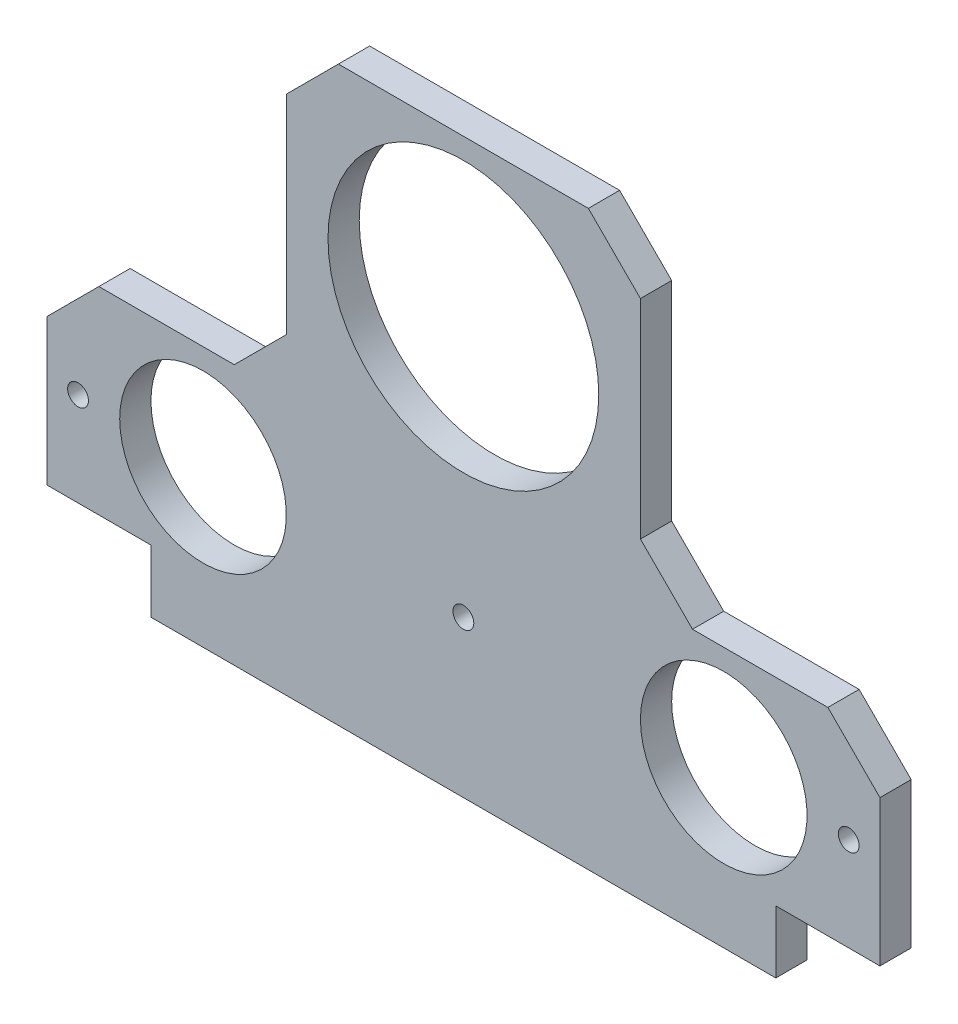
ISO-10303-21;
HEADER;
FILE_DESCRIPTION(('STEP AP214'),'2;1');
FILE_NAME('part.step','',(''),(''),'','','');
FILE_SCHEMA(('AUTOMOTIVE_DESIGN { 1 0 10303 214 1 1 1 1 }'));
ENDSEC;
DATA;
#1=APPLICATION_CONTEXT('core data for automotive mechanical design processes');
#2=APPLICATION_PROTOCOL_DEFINITION('international standard','automotive_design',2000,#1);
#3=PRODUCT_CONTEXT('',#1,'mechanical');
#4=PRODUCT('Part','Part','',(#3));
#5=PRODUCT_RELATED_PRODUCT_CATEGORY('part','',(#4));
#6=PRODUCT_DEFINITION_FORMATION('','',#4);
#7=PRODUCT_DEFINITION_CONTEXT('part definition',#1,'design');
#8=PRODUCT_DEFINITION('design','',#6,#7);
#9=PRODUCT_DEFINITION_SHAPE('','',#8);
#10=(LENGTH_UNIT() NAMED_UNIT(*) SI_UNIT(.MILLI.,.METRE.));
#11=(NAMED_UNIT(*) PLANE_ANGLE_UNIT() SI_UNIT($,.RADIAN.));
#12=(NAMED_UNIT(*) SI_UNIT($,.STERADIAN.) SOLID_ANGLE_UNIT());
#13=UNCERTAINTY_MEASURE_WITH_UNIT(LENGTH_MEASURE(1.E-05),#10,'distance_accuracy_value','');
#14=(GEOMETRIC_REPRESENTATION_CONTEXT(3) GLOBAL_UNCERTAINTY_ASSIGNED_CONTEXT((#13)) GLOBAL_UNIT_ASSIGNED_CONTEXT((#10,
#11,#12)) REPRESENTATION_CONTEXT('',''));
#15=CARTESIAN_POINT('',(0.,0.,0.));
#16=DIRECTION('',(0.,0.,1.));
#17=DIRECTION('',(1.,0.,0.));
#18=AXIS2_PLACEMENT_3D('',#15,#16,#17);
#19=CARTESIAN_POINT('',(-17.,25.,12.));
#20=DIRECTION('',(1.,0.,0.));
#21=DIRECTION('',(0.,1.,0.));
#22=AXIS2_PLACEMENT_3D('',#19,#20,#21);
#23=PLANE('',#22);
#24=DIRECTION('',(0.,0.,1.));
#25=VECTOR('',#24,1.);
#26=CARTESIAN_POINT('',(-17.,30.,12.));
#27=LINE('',#26,#25);
#28=CARTESIAN_POINT('',(-17.,30.,3.));
#29=VERTEX_POINT('',#28);
#30=CARTESIAN_POINT('',(-17.,30.,6.));
#31=VERTEX_POINT('',#30);
#32=EDGE_CURVE('E194',#29,#31,#27,.T.);
#33=ORIENTED_EDGE('',*,*,#32,.T.);
#34=DIRECTION('',(0.,1.,0.));
#35=VECTOR('',#34,1.);
#36=CARTESIAN_POINT('',(-17.,25.,6.));
#37=LINE('',#36,#35);
#38=CARTESIAN_POINT('',(-17.,50.,6.));
#39=VERTEX_POINT('',#38);
#40=EDGE_CURVE('E324',#31,#39,#37,.T.);
#41=ORIENTED_EDGE('',*,*,#40,.T.);
#42=DIRECTION('',(0.,0.,-1.));
#43=VECTOR('',#42,1.);
#44=CARTESIAN_POINT('',(-17.,50.,12.));
#45=LINE('',#44,#43);
#46=CARTESIAN_POINT('',(-17.,50.,3.));
#47=VERTEX_POINT('',#46);
#48=EDGE_CURVE('E197',#39,#47,#45,.T.);
#49=ORIENTED_EDGE('',*,*,#48,.T.);
#50=DIRECTION('',(0.,-1.,0.));
#51=VECTOR('',#50,1.);
#52=CARTESIAN_POINT('',(-17.,25.,3.));
#53=LINE('',#52,#51);
#54=EDGE_CURVE('E241',#47,#29,#53,.T.);
#55=ORIENTED_EDGE('',*,*,#54,.T.);
#56=EDGE_LOOP('',(#33,#41,#49,#55));
#57=FACE_BOUND('',#56,.T.);
#58=ADVANCED_FACE('F32',(#57),#23,.F.);
#59=CARTESIAN_POINT('',(-40.,25.,12.));
#60=DIRECTION('',(0.,-1.,0.));
#61=DIRECTION('',(1.,0.,0.));
#62=AXIS2_PLACEMENT_3D('',#59,#60,#61);
#63=PLANE('',#62);
#64=DIRECTION('',(0.,0.,1.));
#65=VECTOR('',#64,1.);
#66=CARTESIAN_POINT('',(-35.,25.,12.));
#67=LINE('',#66,#65);
#68=CARTESIAN_POINT('',(-35.,25.,3.));
#69=VERTEX_POINT('',#68);
#70=CARTESIAN_POINT('',(-35.,25.,6.));
#71=VERTEX_POINT('',#70);
#72=EDGE_CURVE('E207',#69,#71,#67,.T.);
#73=ORIENTED_EDGE('',*,*,#72,.T.);
#74=DIRECTION('',(1.,0.,0.));
#75=VECTOR('',#74,1.);
#76=CARTESIAN_POINT('',(-40.,25.,6.));
#77=LINE('',#76,#75);
#78=CARTESIAN_POINT('',(-22.,25.,6.));
#79=VERTEX_POINT('',#78);
#80=EDGE_CURVE('E49',#71,#79,#77,.T.);
#81=ORIENTED_EDGE('',*,*,#80,.T.);
#82=DIRECTION('',(0.,0.,-1.));
#83=VECTOR('',#82,1.);
#84=CARTESIAN_POINT('',(-22.,25.,0.));
#85=LINE('',#84,#83);
#86=CARTESIAN_POINT('',(-22.,25.,3.));
#87=VERTEX_POINT('',#86);
#88=EDGE_CURVE('E41',#79,#87,#85,.T.);
#89=ORIENTED_EDGE('',*,*,#88,.T.);
#90=DIRECTION('',(-1.,0.,0.));
#91=VECTOR('',#90,1.);
#92=CARTESIAN_POINT('',(-40.,25.,3.));
#93=LINE('',#92,#91);
#94=EDGE_CURVE('E235',#87,#69,#93,.T.);
#95=ORIENTED_EDGE('',*,*,#94,.T.);
#96=EDGE_LOOP('',(#73,#81,#89,#95));
#97=FACE_BOUND('',#96,.T.);
#98=ADVANCED_FACE('F368',(#97),#63,.F.);
#99=CARTESIAN_POINT('',(-40.,0.,12.));
#100=DIRECTION('',(1.,0.,0.));
#101=DIRECTION('',(0.,0.,-1.));
#102=AXIS2_PLACEMENT_3D('',#99,#100,#101);
#103=PLANE('',#102);
#104=DIRECTION('',(0.,0.,1.));
#105=VECTOR('',#104,1.);
#106=CARTESIAN_POINT('',(-40.,6.,0.));
#107=LINE('',#106,#105);
#108=CARTESIAN_POINT('',(-40.,6.,3.));
#109=VERTEX_POINT('',#108);
#110=CARTESIAN_POINT('',(-40.,6.,6.));
#111=VERTEX_POINT('',#110);
#112=EDGE_CURVE('E189',#109,#111,#107,.T.);
#113=ORIENTED_EDGE('',*,*,#112,.T.);
#114=DIRECTION('',(0.,1.,0.));
#115=VECTOR('',#114,1.);
#116=CARTESIAN_POINT('',(-40.,0.,6.));
#117=LINE('',#116,#115);
#118=CARTESIAN_POINT('',(-40.,20.,6.));
#119=VERTEX_POINT('',#118);
#120=EDGE_CURVE('E308',#111,#119,#117,.T.);
#121=ORIENTED_EDGE('',*,*,#120,.T.);
#122=DIRECTION('',(0.,0.,-1.));
#123=VECTOR('',#122,1.);
#124=CARTESIAN_POINT('',(-40.,20.,12.));
#125=LINE('',#124,#123);
#126=CARTESIAN_POINT('',(-40.,20.,3.));
#127=VERTEX_POINT('',#126);
#128=EDGE_CURVE('E11',#119,#127,#125,.T.);
#129=ORIENTED_EDGE('',*,*,#128,.T.);
#130=DIRECTION('',(0.,1.,0.));
#131=VECTOR('',#130,1.);
#132=CARTESIAN_POINT('',(-40.,0.,3.));
#133=LINE('',#132,#131);
#134=EDGE_CURVE('E220',#109,#127,#133,.T.);
#135=ORIENTED_EDGE('',*,*,#134,.F.);
#136=EDGE_LOOP('',(#113,#121,#129,#135));
#137=FACE_BOUND('',#136,.T.);
#138=ADVANCED_FACE('F373',(#137),#103,.F.);
#139=CARTESIAN_POINT('',(-40.,0.,12.));
#140=DIRECTION('',(0.,1.,0.));
#141=DIRECTION('',(0.,0.,1.));
#142=AXIS2_PLACEMENT_3D('',#139,#140,#141);
#143=PLANE('',#142);
#144=DIRECTION('',(0.,0.,1.));
#145=VECTOR('',#144,1.);
#146=CARTESIAN_POINT('',(30.,0.,0.));
#147=LINE('',#146,#145);
#148=CARTESIAN_POINT('',(30.,0.,3.));
#149=VERTEX_POINT('',#148);
#150=CARTESIAN_POINT('',(30.,0.,6.));
#151=VERTEX_POINT('',#150);
#152=EDGE_CURVE('E280',#149,#151,#147,.T.);
#153=ORIENTED_EDGE('',*,*,#152,.T.);
#154=DIRECTION('',(-1.,0.,0.));
#155=VECTOR('',#154,1.);
#156=CARTESIAN_POINT('',(-40.,0.,6.));
#157=LINE('',#156,#155);
#158=CARTESIAN_POINT('',(-30.,0.,6.));
#159=VERTEX_POINT('',#158);
#160=EDGE_CURVE('E180',#151,#159,#157,.T.);
#161=ORIENTED_EDGE('',*,*,#160,.T.);
#162=DIRECTION('',(0.,0.,1.));
#163=VECTOR('',#162,1.);
#164=CARTESIAN_POINT('',(-30.,0.,0.));
#165=LINE('',#164,#163);
#166=CARTESIAN_POINT('',(-30.,0.,3.));
#167=VERTEX_POINT('',#166);
#168=EDGE_CURVE('E283',#167,#159,#165,.T.);
#169=ORIENTED_EDGE('',*,*,#168,.F.);
#170=DIRECTION('',(1.,0.,0.));
#171=VECTOR('',#170,1.);
#172=CARTESIAN_POINT('',(-40.,0.,3.));
#173=LINE('',#172,#171);
#174=EDGE_CURVE('E225',#167,#149,#173,.T.);
#175=ORIENTED_EDGE('',*,*,#174,.T.);
#176=EDGE_LOOP('',(#153,#161,#169,#175));
#177=FACE_BOUND('',#176,.T.);
#178=ADVANCED_FACE('F303',(#177),#143,.F.);
#179=CARTESIAN_POINT('',(40.,0.,12.));
#180=DIRECTION('',(-1.,0.,0.));
#181=DIRECTION('',(0.,0.,1.));
#182=AXIS2_PLACEMENT_3D('',#179,#180,#181);
#183=PLANE('',#182);
#184=DIRECTION('',(0.,0.,1.));
#185=VECTOR('',#184,1.);
#186=CARTESIAN_POINT('',(40.,20.,12.));
#187=LINE('',#186,#185);
#188=CARTESIAN_POINT('',(40.,20.,3.));
#189=VERTEX_POINT('',#188);
#190=CARTESIAN_POINT('',(40.,20.,6.));
#191=VERTEX_POINT('',#190);
#192=EDGE_CURVE('E204',#189,#191,#187,.T.);
#193=ORIENTED_EDGE('',*,*,#192,.T.);
#194=DIRECTION('',(0.,1.,0.));
#195=VECTOR('',#194,1.);
#196=CARTESIAN_POINT('',(40.,0.,6.));
#197=LINE('',#196,#195);
#198=CARTESIAN_POINT('',(40.,6.,6.));
#199=VERTEX_POINT('',#198);
#200=EDGE_CURVE('E306',#199,#191,#197,.T.);
#201=ORIENTED_EDGE('',*,*,#200,.F.);
#202=DIRECTION('',(0.,0.,1.));
#203=VECTOR('',#202,1.);
#204=CARTESIAN_POINT('',(40.,6.,0.));
#205=LINE('',#204,#203);
#206=CARTESIAN_POINT('',(40.,6.,3.));
#207=VERTEX_POINT('',#206);
#208=EDGE_CURVE('E279',#207,#199,#205,.T.);
#209=ORIENTED_EDGE('',*,*,#208,.F.);
#210=DIRECTION('',(0.,1.,0.));
#211=VECTOR('',#210,1.);
#212=CARTESIAN_POINT('',(40.,0.,3.));
#213=LINE('',#212,#211);
#214=EDGE_CURVE('E213',#207,#189,#213,.T.);
#215=ORIENTED_EDGE('',*,*,#214,.T.);
#216=EDGE_LOOP('',(#193,#201,#209,#215));
#217=FACE_BOUND('',#216,.T.);
#218=ADVANCED_FACE('F384',(#217),#183,.F.);
#219=CARTESIAN_POINT('',(40.,25.,12.));
#220=DIRECTION('',(0.,-1.,0.));
#221=DIRECTION('',(1.,0.,0.));
#222=AXIS2_PLACEMENT_3D('',#219,#220,#221);
#223=PLANE('',#222);
#224=DIRECTION('',(0.,0.,1.));
#225=VECTOR('',#224,1.);
#226=CARTESIAN_POINT('',(22.,25.,12.));
#227=LINE('',#226,#225);
#228=CARTESIAN_POINT('',(22.,25.,3.));
#229=VERTEX_POINT('',#228);
#230=CARTESIAN_POINT('',(22.,25.,6.));
#231=VERTEX_POINT('',#230);
#232=EDGE_CURVE('E199',#229,#231,#227,.T.);
#233=ORIENTED_EDGE('',*,*,#232,.T.);
#234=DIRECTION('',(1.,0.,0.));
#235=VECTOR('',#234,1.);
#236=CARTESIAN_POINT('',(40.,25.,6.));
#237=LINE('',#236,#235);
#238=CARTESIAN_POINT('',(35.,25.,6.));
#239=VERTEX_POINT('',#238);
#240=EDGE_CURVE('E333',#231,#239,#237,.T.);
#241=ORIENTED_EDGE('',*,*,#240,.T.);
#242=DIRECTION('',(0.,0.,-1.));
#243=VECTOR('',#242,1.);
#244=CARTESIAN_POINT('',(35.,25.,12.));
#245=LINE('',#244,#243);
#246=CARTESIAN_POINT('',(35.,25.,3.));
#247=VERTEX_POINT('',#246);
#248=EDGE_CURVE('E202',#239,#247,#245,.T.);
#249=ORIENTED_EDGE('',*,*,#248,.T.);
#250=DIRECTION('',(-1.,0.,0.));
#251=VECTOR('',#250,1.);
#252=CARTESIAN_POINT('',(40.,25.,3.));
#253=LINE('',#252,#251);
#254=EDGE_CURVE('E252',#247,#229,#253,.T.);
#255=ORIENTED_EDGE('',*,*,#254,.T.);
#256=EDGE_LOOP('',(#233,#241,#249,#255));
#257=FACE_BOUND('',#256,.T.);
#258=ADVANCED_FACE('F390',(#257),#223,.F.);
#259=CARTESIAN_POINT('',(17.,25.,12.));
#260=DIRECTION('',(-1.,0.,0.));
#261=DIRECTION('',(0.,-1.,0.));
#262=AXIS2_PLACEMENT_3D('',#259,#260,#261);
#263=PLANE('',#262);
#264=DIRECTION('',(0.,0.,1.));
#265=VECTOR('',#264,1.);
#266=CARTESIAN_POINT('',(17.,50.,12.));
#267=LINE('',#266,#265);
#268=CARTESIAN_POINT('',(17.,50.,3.));
#269=VERTEX_POINT('',#268);
#270=CARTESIAN_POINT('',(17.,50.,6.));
#271=VERTEX_POINT('',#270);
#272=EDGE_CURVE('E187',#269,#271,#267,.T.);
#273=ORIENTED_EDGE('',*,*,#272,.T.);
#274=DIRECTION('',(0.,-1.,0.));
#275=VECTOR('',#274,1.);
#276=CARTESIAN_POINT('',(17.,25.,6.));
#277=LINE('',#276,#275);
#278=CARTESIAN_POINT('',(17.,30.,6.));
#279=VERTEX_POINT('',#278);
#280=EDGE_CURVE('E164',#271,#279,#277,.T.);
#281=ORIENTED_EDGE('',*,*,#280,.T.);
#282=DIRECTION('',(0.,0.,-1.));
#283=VECTOR('',#282,1.);
#284=CARTESIAN_POINT('',(17.,30.,0.));
#285=LINE('',#284,#283);
#286=CARTESIAN_POINT('',(17.,30.,3.));
#287=VERTEX_POINT('',#286);
#288=EDGE_CURVE('E185',#279,#287,#285,.T.);
#289=ORIENTED_EDGE('',*,*,#288,.T.);
#290=DIRECTION('',(0.,1.,0.));
#291=VECTOR('',#290,1.);
#292=CARTESIAN_POINT('',(17.,25.,3.));
#293=LINE('',#292,#291);
#294=EDGE_CURVE('E249',#287,#269,#293,.T.);
#295=ORIENTED_EDGE('',*,*,#294,.T.);
#296=EDGE_LOOP('',(#273,#281,#289,#295));
#297=FACE_BOUND('',#296,.T.);
#298=ADVANCED_FACE('F397',(#297),#263,.F.);
#299=CARTESIAN_POINT('',(17.,55.,12.));
#300=DIRECTION('',(0.,-1.,0.));
#301=DIRECTION('',(1.,0.,0.));
#302=AXIS2_PLACEMENT_3D('',#299,#300,#301);
#303=PLANE('',#302);
#304=DIRECTION('',(0.,0.,1.));
#305=VECTOR('',#304,1.);
#306=CARTESIAN_POINT('',(-12.,55.,12.));
#307=LINE('',#306,#305);
#308=CARTESIAN_POINT('',(-12.,55.,3.));
#309=VERTEX_POINT('',#308);
#310=CARTESIAN_POINT('',(-12.,55.,6.));
#311=VERTEX_POINT('',#310);
#312=EDGE_CURVE('E179',#309,#311,#307,.T.);
#313=ORIENTED_EDGE('',*,*,#312,.T.);
#314=DIRECTION('',(-1.,0.,0.));
#315=VECTOR('',#314,1.);
#316=CARTESIAN_POINT('',(-40.,55.,6.));
#317=LINE('',#316,#315);
#318=CARTESIAN_POINT('',(12.,55.,6.));
#319=VERTEX_POINT('',#318);
#320=EDGE_CURVE('E161',#319,#311,#317,.T.);
#321=ORIENTED_EDGE('',*,*,#320,.F.);
#322=DIRECTION('',(0.,0.,-1.));
#323=VECTOR('',#322,1.);
#324=CARTESIAN_POINT('',(12.,55.,12.));
#325=LINE('',#324,#323);
#326=CARTESIAN_POINT('',(12.,55.,3.));
#327=VERTEX_POINT('',#326);
#328=EDGE_CURVE('E176',#319,#327,#325,.T.);
#329=ORIENTED_EDGE('',*,*,#328,.T.);
#330=DIRECTION('',(1.,0.,0.));
#331=VECTOR('',#330,1.);
#332=CARTESIAN_POINT('',(-40.,55.,3.));
#333=LINE('',#332,#331);
#334=EDGE_CURVE('E228',#309,#327,#333,.T.);
#335=ORIENTED_EDGE('',*,*,#334,.F.);
#336=EDGE_LOOP('',(#313,#321,#329,#335));
#337=FACE_BOUND('',#336,.T.);
#338=ADVANCED_FACE('F174',(#337),#303,.F.);
#339=CARTESIAN_POINT('',(0.,40.,12.));
#340=DIRECTION('',(0.,0.,-1.));
#341=DIRECTION('',(-1.,0.,0.));
#342=AXIS2_PLACEMENT_3D('',#339,#340,#341);
#343=CYLINDRICAL_SURFACE('',#342,13.);
#344=CARTESIAN_POINT('',(0.,40.,6.));
#345=DIRECTION('',(0.,0.,-1.));
#346=DIRECTION('',(-1.,0.,0.));
#347=AXIS2_PLACEMENT_3D('',#344,#345,#346);
#348=CIRCLE('',#347,13.);
#349=CARTESIAN_POINT('',(-13.,40.,6.));
#350=VERTEX_POINT('',#349);
#351=EDGE_CURVE('E351',#350,#350,#348,.T.);
#352=ORIENTED_EDGE('',*,*,#351,.F.);
#353=EDGE_LOOP('',(#352));
#354=FACE_BOUND('',#353,.T.);
#355=CARTESIAN_POINT('',(0.,40.,3.));
#356=DIRECTION('',(0.,0.,1.));
#357=DIRECTION('',(1.,0.,0.));
#358=AXIS2_PLACEMENT_3D('',#355,#356,#357);
#359=CIRCLE('',#358,13.);
#360=CARTESIAN_POINT('',(13.,40.,3.));
#361=VERTEX_POINT('',#360);
#362=EDGE_CURVE('E276',#361,#361,#359,.T.);
#363=ORIENTED_EDGE('',*,*,#362,.F.);
#364=EDGE_LOOP('',(#363));
#365=FACE_BOUND('',#364,.T.);
#366=ADVANCED_FACE('F404',(#354,#365),#343,.F.);
#367=CARTESIAN_POINT('',(25.,15.,6.));
#368=DIRECTION('',(0.,0.,-1.));
#369=DIRECTION('',(-1.,0.,0.));
#370=AXIS2_PLACEMENT_3D('',#367,#368,#369);
#371=CYLINDRICAL_SURFACE('',#370,8.);
#372=CARTESIAN_POINT('',(25.,15.,3.));
#373=DIRECTION('',(0.,0.,1.));
#374=DIRECTION('',(1.,0.,0.));
#375=AXIS2_PLACEMENT_3D('',#372,#373,#374);
#376=CIRCLE('',#375,8.);
#377=CARTESIAN_POINT('',(33.,15.,3.));
#378=VERTEX_POINT('',#377);
#379=EDGE_CURVE('E273',#378,#378,#376,.F.);
#380=ORIENTED_EDGE('',*,*,#379,.T.);
#381=EDGE_LOOP('',(#380));
#382=FACE_BOUND('',#381,.T.);
#383=CARTESIAN_POINT('',(25.,15.,6.));
#384=DIRECTION('',(0.,0.,-1.));
#385=DIRECTION('',(-1.,0.,0.));
#386=AXIS2_PLACEMENT_3D('',#383,#384,#385);
#387=CIRCLE('',#386,8.);
#388=CARTESIAN_POINT('',(17.,15.,6.));
#389=VERTEX_POINT('',#388);
#390=EDGE_CURVE('E348',#389,#389,#387,.F.);
#391=ORIENTED_EDGE('',*,*,#390,.T.);
#392=EDGE_LOOP('',(#391));
#393=FACE_BOUND('',#392,.T.);
#394=ADVANCED_FACE('F453',(#382,#393),#371,.F.);
#395=CARTESIAN_POINT('',(-25.,15.,6.));
#396=DIRECTION('',(0.,0.,-1.));
#397=DIRECTION('',(-1.,0.,0.));
#398=AXIS2_PLACEMENT_3D('',#395,#396,#397);
#399=CYLINDRICAL_SURFACE('',#398,8.);
#400=CARTESIAN_POINT('',(-25.,15.,3.));
#401=DIRECTION('',(0.,0.,1.));
#402=DIRECTION('',(1.,0.,0.));
#403=AXIS2_PLACEMENT_3D('',#400,#401,#402);
#404=CIRCLE('',#403,8.);
#405=CARTESIAN_POINT('',(-17.,15.,3.));
#406=VERTEX_POINT('',#405);
#407=EDGE_CURVE('E270',#406,#406,#404,.F.);
#408=ORIENTED_EDGE('',*,*,#407,.T.);
#409=EDGE_LOOP('',(#408));
#410=FACE_BOUND('',#409,.T.);
#411=CARTESIAN_POINT('',(-25.,15.,6.));
#412=DIRECTION('',(0.,0.,-1.));
#413=DIRECTION('',(-1.,0.,0.));
#414=AXIS2_PLACEMENT_3D('',#411,#412,#413);
#415=CIRCLE('',#414,8.);
#416=CARTESIAN_POINT('',(-33.,15.,6.));
#417=VERTEX_POINT('',#416);
#418=EDGE_CURVE('E345',#417,#417,#415,.F.);
#419=ORIENTED_EDGE('',*,*,#418,.T.);
#420=EDGE_LOOP('',(#419));
#421=FACE_BOUND('',#420,.T.);
#422=ADVANCED_FACE('F448',(#410,#421),#399,.F.);
#423=CARTESIAN_POINT('',(-40.,6.,0.));
#424=DIRECTION('',(0.,1.,0.));
#425=DIRECTION('',(0.,0.,1.));
#426=AXIS2_PLACEMENT_3D('',#423,#424,#425);
#427=PLANE('',#426);
#428=DIRECTION('',(0.,0.,1.));
#429=VECTOR('',#428,1.);
#430=CARTESIAN_POINT('',(-30.,6.,0.));
#431=LINE('',#430,#429);
#432=CARTESIAN_POINT('',(-30.,6.,3.));
#433=VERTEX_POINT('',#432);
#434=CARTESIAN_POINT('',(-30.,6.,6.));
#435=VERTEX_POINT('',#434);
#436=EDGE_CURVE('E291',#433,#435,#431,.T.);
#437=ORIENTED_EDGE('',*,*,#436,.T.);
#438=DIRECTION('',(-1.,0.,0.));
#439=VECTOR('',#438,1.);
#440=CARTESIAN_POINT('',(-40.,6.,6.));
#441=LINE('',#440,#439);
#442=EDGE_CURVE('E342',#435,#111,#441,.T.);
#443=ORIENTED_EDGE('',*,*,#442,.T.);
#444=ORIENTED_EDGE('',*,*,#112,.F.);
#445=DIRECTION('',(1.,0.,0.));
#446=VECTOR('',#445,1.);
#447=CARTESIAN_POINT('',(-40.,6.,3.));
#448=LINE('',#447,#446);
#449=EDGE_CURVE('E267',#109,#433,#448,.T.);
#450=ORIENTED_EDGE('',*,*,#449,.T.);
#451=EDGE_LOOP('',(#437,#443,#444,#450));
#452=FACE_BOUND('',#451,.T.);
#453=ADVANCED_FACE('F376',(#452),#427,.F.);
#454=CARTESIAN_POINT('',(-30.,0.,0.));
#455=DIRECTION('',(1.,0.,0.));
#456=DIRECTION('',(0.,0.,-1.));
#457=AXIS2_PLACEMENT_3D('',#454,#455,#456);
#458=PLANE('',#457);
#459=ORIENTED_EDGE('',*,*,#168,.T.);
#460=DIRECTION('',(0.,1.,0.));
#461=VECTOR('',#460,1.);
#462=CARTESIAN_POINT('',(-30.,0.,6.));
#463=LINE('',#462,#461);
#464=EDGE_CURVE('E299',#159,#435,#463,.T.);
#465=ORIENTED_EDGE('',*,*,#464,.T.);
#466=ORIENTED_EDGE('',*,*,#436,.F.);
#467=DIRECTION('',(0.,-1.,0.));
#468=VECTOR('',#467,1.);
#469=CARTESIAN_POINT('',(-30.,0.,3.));
#470=LINE('',#469,#468);
#471=EDGE_CURVE('E264',#433,#167,#470,.T.);
#472=ORIENTED_EDGE('',*,*,#471,.T.);
#473=EDGE_LOOP('',(#459,#465,#466,#472));
#474=FACE_BOUND('',#473,.T.);
#475=ADVANCED_FACE('F297',(#474),#458,.F.);
#476=CARTESIAN_POINT('',(30.,0.,0.));
#477=DIRECTION('',(-1.,0.,0.));
#478=DIRECTION('',(0.,0.,1.));
#479=AXIS2_PLACEMENT_3D('',#476,#477,#478);
#480=PLANE('',#479);
#481=DIRECTION('',(0.,0.,1.));
#482=VECTOR('',#481,1.);
#483=CARTESIAN_POINT('',(30.,6.,0.));
#484=LINE('',#483,#482);
#485=CARTESIAN_POINT('',(30.,6.,3.));
#486=VERTEX_POINT('',#485);
#487=CARTESIAN_POINT('',(30.,6.,6.));
#488=VERTEX_POINT('',#487);
#489=EDGE_CURVE('E284',#486,#488,#484,.T.);
#490=ORIENTED_EDGE('',*,*,#489,.T.);
#491=DIRECTION('',(0.,-1.,0.));
#492=VECTOR('',#491,1.);
#493=CARTESIAN_POINT('',(30.,0.,6.));
#494=LINE('',#493,#492);
#495=EDGE_CURVE('E339',#488,#151,#494,.T.);
#496=ORIENTED_EDGE('',*,*,#495,.T.);
#497=ORIENTED_EDGE('',*,*,#152,.F.);
#498=DIRECTION('',(0.,1.,0.));
#499=VECTOR('',#498,1.);
#500=CARTESIAN_POINT('',(30.,0.,3.));
#501=LINE('',#500,#499);
#502=EDGE_CURVE('E261',#149,#486,#501,.T.);
#503=ORIENTED_EDGE('',*,*,#502,.T.);
#504=EDGE_LOOP('',(#490,#496,#497,#503));
#505=FACE_BOUND('',#504,.T.);
#506=ADVANCED_FACE('F379',(#505),#480,.F.);
#507=CARTESIAN_POINT('',(40.,6.,0.));
#508=DIRECTION('',(0.,1.,0.));
#509=DIRECTION('',(0.,0.,1.));
#510=AXIS2_PLACEMENT_3D('',#507,#508,#509);
#511=PLANE('',#510);
#512=ORIENTED_EDGE('',*,*,#208,.T.);
#513=DIRECTION('',(-1.,0.,0.));
#514=VECTOR('',#513,1.);
#515=CARTESIAN_POINT('',(40.,6.,6.));
#516=LINE('',#515,#514);
#517=EDGE_CURVE('E169',#199,#488,#516,.T.);
#518=ORIENTED_EDGE('',*,*,#517,.T.);
#519=ORIENTED_EDGE('',*,*,#489,.F.);
#520=DIRECTION('',(1.,0.,0.));
#521=VECTOR('',#520,1.);
#522=CARTESIAN_POINT('',(40.,6.,3.));
#523=LINE('',#522,#521);
#524=EDGE_CURVE('E258',#486,#207,#523,.T.);
#525=ORIENTED_EDGE('',*,*,#524,.T.);
#526=EDGE_LOOP('',(#512,#518,#519,#525));
#527=FACE_BOUND('',#526,.T.);
#528=ADVANCED_FACE('F381',(#527),#511,.F.);
#529=CARTESIAN_POINT('',(12.,55.,12.));
#530=DIRECTION('',(-0.707106781186549,-0.707106781186547,0.));
#531=DIRECTION('',(0.,0.,-1.));
#532=AXIS2_PLACEMENT_3D('',#529,#530,#531);
#533=PLANE('',#532);
#534=DIRECTION('',(0.707106781186547,-0.707106781186549,0.));
#535=VECTOR('',#534,1.);
#536=CARTESIAN_POINT('',(12.,55.,6.));
#537=LINE('',#536,#535);
#538=EDGE_CURVE('E157',#271,#319,#537,.F.);
#539=ORIENTED_EDGE('',*,*,#538,.F.);
#540=ORIENTED_EDGE('',*,*,#272,.F.);
#541=DIRECTION('',(-0.707106781186547,0.707106781186549,0.));
#542=VECTOR('',#541,1.);
#543=CARTESIAN_POINT('',(12.,55.,3.));
#544=LINE('',#543,#542);
#545=EDGE_CURVE('E184',#327,#269,#544,.F.);
#546=ORIENTED_EDGE('',*,*,#545,.F.);
#547=ORIENTED_EDGE('',*,*,#328,.F.);
#548=EDGE_LOOP('',(#539,#540,#546,#547));
#549=FACE_BOUND('',#548,.T.);
#550=ADVANCED_FACE('F183',(#549),#533,.F.);
#551=CARTESIAN_POINT('',(-17.,50.,12.));
#552=DIRECTION('',(0.707106781186547,-0.707106781186547,0.));
#553=DIRECTION('',(0.,0.,-1.));
#554=AXIS2_PLACEMENT_3D('',#551,#552,#553);
#555=PLANE('',#554);
#556=DIRECTION('',(0.707106781186548,0.707106781186548,0.));
#557=VECTOR('',#556,1.);
#558=CARTESIAN_POINT('',(-17.,50.,6.));
#559=LINE('',#558,#557);
#560=EDGE_CURVE('E327',#311,#39,#559,.F.);
#561=ORIENTED_EDGE('',*,*,#560,.F.);
#562=ORIENTED_EDGE('',*,*,#312,.F.);
#563=DIRECTION('',(-0.707106781186548,-0.707106781186548,0.));
#564=VECTOR('',#563,1.);
#565=CARTESIAN_POINT('',(-17.,50.,3.));
#566=LINE('',#565,#564);
#567=EDGE_CURVE('E244',#47,#309,#566,.F.);
#568=ORIENTED_EDGE('',*,*,#567,.F.);
#569=ORIENTED_EDGE('',*,*,#48,.F.);
#570=EDGE_LOOP('',(#561,#562,#568,#569));
#571=FACE_BOUND('',#570,.T.);
#572=ADVANCED_FACE('F360',(#571),#555,.F.);
#573=CARTESIAN_POINT('',(35.,25.,12.));
#574=DIRECTION('',(-0.707106781186549,-0.707106781186545,0.));
#575=DIRECTION('',(0.,0.,-1.));
#576=AXIS2_PLACEMENT_3D('',#573,#574,#575);
#577=PLANE('',#576);
#578=DIRECTION('',(0.707106781186546,-0.70710678118655,0.));
#579=VECTOR('',#578,1.);
#580=CARTESIAN_POINT('',(35.,25.,6.));
#581=LINE('',#580,#579);
#582=EDGE_CURVE('E170',#191,#239,#581,.F.);
#583=ORIENTED_EDGE('',*,*,#582,.F.);
#584=ORIENTED_EDGE('',*,*,#192,.F.);
#585=DIRECTION('',(-0.707106781186546,0.70710678118655,0.));
#586=VECTOR('',#585,1.);
#587=CARTESIAN_POINT('',(35.,25.,3.));
#588=LINE('',#587,#586);
#589=EDGE_CURVE('E255',#247,#189,#588,.F.);
#590=ORIENTED_EDGE('',*,*,#589,.F.);
#591=ORIENTED_EDGE('',*,*,#248,.F.);
#592=EDGE_LOOP('',(#583,#584,#590,#591));
#593=FACE_BOUND('',#592,.T.);
#594=ADVANCED_FACE('F387',(#593),#577,.F.);
#595=CARTESIAN_POINT('',(17.,30.,12.));
#596=DIRECTION('',(0.707106781186551,0.707106781186544,0.));
#597=DIRECTION('',(0.,0.,1.));
#598=AXIS2_PLACEMENT_3D('',#595,#596,#597);
#599=PLANE('',#598);
#600=ORIENTED_EDGE('',*,*,#288,.F.);
#601=DIRECTION('',(-0.707106781186544,0.707106781186551,0.));
#602=VECTOR('',#601,1.);
#603=CARTESIAN_POINT('',(17.,30.,6.));
#604=LINE('',#603,#602);
#605=EDGE_CURVE('E329',#279,#231,#604,.F.);
#606=ORIENTED_EDGE('',*,*,#605,.T.);
#607=ORIENTED_EDGE('',*,*,#232,.F.);
#608=DIRECTION('',(0.707106781186544,-0.707106781186551,0.));
#609=VECTOR('',#608,1.);
#610=CARTESIAN_POINT('',(17.,30.,3.));
#611=LINE('',#610,#609);
#612=EDGE_CURVE('E246',#229,#287,#611,.F.);
#613=ORIENTED_EDGE('',*,*,#612,.T.);
#614=EDGE_LOOP('',(#600,#606,#607,#613));
#615=FACE_BOUND('',#614,.T.);
#616=ADVANCED_FACE('F395',(#615),#599,.T.);
#617=CARTESIAN_POINT('',(-22.,25.,12.));
#618=DIRECTION('',(-0.707106781186544,0.707106781186551,0.));
#619=DIRECTION('',(0.,0.,1.));
#620=AXIS2_PLACEMENT_3D('',#617,#618,#619);
#621=PLANE('',#620);
#622=ORIENTED_EDGE('',*,*,#88,.F.);
#623=DIRECTION('',(-0.707106781186551,-0.707106781186544,0.));
#624=VECTOR('',#623,1.);
#625=CARTESIAN_POINT('',(-22.,25.,6.));
#626=LINE('',#625,#624);
#627=EDGE_CURVE('E321',#79,#31,#626,.F.);
#628=ORIENTED_EDGE('',*,*,#627,.T.);
#629=ORIENTED_EDGE('',*,*,#32,.F.);
#630=DIRECTION('',(0.707106781186551,0.707106781186544,0.));
#631=VECTOR('',#630,1.);
#632=CARTESIAN_POINT('',(-22.,25.,3.));
#633=LINE('',#632,#631);
#634=EDGE_CURVE('E238',#29,#87,#633,.F.);
#635=ORIENTED_EDGE('',*,*,#634,.T.);
#636=EDGE_LOOP('',(#622,#628,#629,#635));
#637=FACE_BOUND('',#636,.T.);
#638=ADVANCED_FACE('F366',(#637),#621,.T.);
#639=CARTESIAN_POINT('',(-40.,20.,12.));
#640=DIRECTION('',(0.707106781186545,-0.707106781186549,0.));
#641=DIRECTION('',(0.,0.,-1.));
#642=AXIS2_PLACEMENT_3D('',#639,#640,#641);
#643=PLANE('',#642);
#644=DIRECTION('',(0.707106781186549,0.707106781186546,0.));
#645=VECTOR('',#644,1.);
#646=CARTESIAN_POINT('',(-40.,20.,6.));
#647=LINE('',#646,#645);
#648=EDGE_CURVE('E318',#71,#119,#647,.F.);
#649=ORIENTED_EDGE('',*,*,#648,.F.);
#650=ORIENTED_EDGE('',*,*,#72,.F.);
#651=DIRECTION('',(-0.707106781186549,-0.707106781186546,0.));
#652=VECTOR('',#651,1.);
#653=CARTESIAN_POINT('',(-40.,20.,3.));
#654=LINE('',#653,#652);
#655=EDGE_CURVE('E233',#127,#69,#654,.F.);
#656=ORIENTED_EDGE('',*,*,#655,.F.);
#657=ORIENTED_EDGE('',*,*,#128,.F.);
#658=EDGE_LOOP('',(#649,#650,#656,#657));
#659=FACE_BOUND('',#658,.T.);
#660=ADVANCED_FACE('F34',(#659),#643,.F.);
#661=CARTESIAN_POINT('',(37.,15.,12.));
#662=DIRECTION('',(0.,0.,-1.));
#663=DIRECTION('',(-1.,0.,0.));
#664=AXIS2_PLACEMENT_3D('',#661,#662,#663);
#665=CYLINDRICAL_SURFACE('',#664,0.999999999999998);
#666=CARTESIAN_POINT('',(37.,15.,6.));
#667=DIRECTION('',(0.,0.,-1.));
#668=DIRECTION('',(-1.,0.,0.));
#669=AXIS2_PLACEMENT_3D('',#666,#667,#668);
#670=CIRCLE('',#669,0.999999999999998);
#671=CARTESIAN_POINT('',(36.,15.,6.));
#672=VERTEX_POINT('',#671);
#673=EDGE_CURVE('E315',#672,#672,#670,.F.);
#674=ORIENTED_EDGE('',*,*,#673,.T.);
#675=EDGE_LOOP('',(#674));
#676=FACE_BOUND('',#675,.T.);
#677=CARTESIAN_POINT('',(37.,15.,3.));
#678=DIRECTION('',(0.,0.,1.));
#679=DIRECTION('',(1.,0.,0.));
#680=AXIS2_PLACEMENT_3D('',#677,#678,#679);
#681=CIRCLE('',#680,0.999999999999998);
#682=CARTESIAN_POINT('',(38.,15.,3.));
#683=VERTEX_POINT('',#682);
#684=EDGE_CURVE('E217',#683,#683,#681,.F.);
#685=ORIENTED_EDGE('',*,*,#684,.T.);
#686=EDGE_LOOP('',(#685));
#687=FACE_BOUND('',#686,.T.);
#688=ADVANCED_FACE('F426',(#676,#687),#665,.F.);
#689=CARTESIAN_POINT('',(-37.,15.,12.));
#690=DIRECTION('',(0.,0.,-1.));
#691=DIRECTION('',(-1.,0.,0.));
#692=AXIS2_PLACEMENT_3D('',#689,#690,#691);
#693=CYLINDRICAL_SURFACE('',#692,0.999999999999998);
#694=CARTESIAN_POINT('',(-37.,15.,6.));
#695=DIRECTION('',(0.,0.,-1.));
#696=DIRECTION('',(-1.,0.,0.));
#697=AXIS2_PLACEMENT_3D('',#694,#695,#696);
#698=CIRCLE('',#697,0.999999999999998);
#699=CARTESIAN_POINT('',(-38.,15.,6.));
#700=VERTEX_POINT('',#699);
#701=EDGE_CURVE('E312',#700,#700,#698,.F.);
#702=ORIENTED_EDGE('',*,*,#701,.T.);
#703=EDGE_LOOP('',(#702));
#704=FACE_BOUND('',#703,.T.);
#705=CARTESIAN_POINT('',(-37.,15.,3.));
#706=DIRECTION('',(0.,0.,1.));
#707=DIRECTION('',(1.,0.,0.));
#708=AXIS2_PLACEMENT_3D('',#705,#706,#707);
#709=CIRCLE('',#708,0.999999999999998);
#710=CARTESIAN_POINT('',(-36.,15.,3.));
#711=VERTEX_POINT('',#710);
#712=EDGE_CURVE('E212',#711,#711,#709,.F.);
#713=ORIENTED_EDGE('',*,*,#712,.T.);
#714=EDGE_LOOP('',(#713));
#715=FACE_BOUND('',#714,.T.);
#716=ADVANCED_FACE('F430',(#704,#715),#693,.F.);
#717=CARTESIAN_POINT('',(0.,15.,12.));
#718=DIRECTION('',(0.,0.,-1.));
#719=DIRECTION('',(-1.,0.,0.));
#720=AXIS2_PLACEMENT_3D('',#717,#718,#719);
#721=CYLINDRICAL_SURFACE('',#720,1.);
#722=CARTESIAN_POINT('',(0.,15.,6.));
#723=DIRECTION('',(0.,0.,-1.));
#724=DIRECTION('',(-1.,0.,0.));
#725=AXIS2_PLACEMENT_3D('',#722,#723,#724);
#726=CIRCLE('',#725,1.);
#727=CARTESIAN_POINT('',(-1.,15.,6.));
#728=VERTEX_POINT('',#727);
#729=EDGE_CURVE('E36',#728,#728,#726,.F.);
#730=ORIENTED_EDGE('',*,*,#729,.T.);
#731=EDGE_LOOP('',(#730));
#732=FACE_BOUND('',#731,.T.);
#733=CARTESIAN_POINT('',(0.,15.,3.));
#734=DIRECTION('',(0.,0.,1.));
#735=DIRECTION('',(1.,0.,0.));
#736=AXIS2_PLACEMENT_3D('',#733,#734,#735);
#737=CIRCLE('',#736,1.);
#738=CARTESIAN_POINT('',(1.,15.,3.));
#739=VERTEX_POINT('',#738);
#740=EDGE_CURVE('E210',#739,#739,#737,.F.);
#741=ORIENTED_EDGE('',*,*,#740,.T.);
#742=EDGE_LOOP('',(#741));
#743=FACE_BOUND('',#742,.T.);
#744=ADVANCED_FACE('F436',(#732,#743),#721,.F.);
#745=CARTESIAN_POINT('',(-40.,0.,3.));
#746=DIRECTION('',(0.,0.,1.));
#747=DIRECTION('',(1.,0.,0.));
#748=AXIS2_PLACEMENT_3D('',#745,#746,#747);
#749=PLANE('',#748);
#750=ORIENTED_EDGE('',*,*,#362,.T.);
#751=EDGE_LOOP('',(#750));
#752=FACE_BOUND('',#751,.T.);
#753=ORIENTED_EDGE('',*,*,#407,.F.);
#754=EDGE_LOOP('',(#753));
#755=FACE_BOUND('',#754,.T.);
#756=ORIENTED_EDGE('',*,*,#712,.F.);
#757=EDGE_LOOP('',(#756));
#758=FACE_BOUND('',#757,.T.);
#759=ORIENTED_EDGE('',*,*,#740,.F.);
#760=EDGE_LOOP('',(#759));
#761=FACE_BOUND('',#760,.T.);
#762=ORIENTED_EDGE('',*,*,#684,.F.);
#763=EDGE_LOOP('',(#762));
#764=FACE_BOUND('',#763,.T.);
#765=ORIENTED_EDGE('',*,*,#134,.T.);
#766=ORIENTED_EDGE('',*,*,#655,.T.);
#767=ORIENTED_EDGE('',*,*,#94,.F.);
#768=ORIENTED_EDGE('',*,*,#634,.F.);
#769=ORIENTED_EDGE('',*,*,#54,.F.);
#770=ORIENTED_EDGE('',*,*,#567,.T.);
#771=ORIENTED_EDGE('',*,*,#334,.T.);
#772=ORIENTED_EDGE('',*,*,#545,.T.);
#773=ORIENTED_EDGE('',*,*,#294,.F.);
#774=ORIENTED_EDGE('',*,*,#612,.F.);
#775=ORIENTED_EDGE('',*,*,#254,.F.);
#776=ORIENTED_EDGE('',*,*,#589,.T.);
#777=ORIENTED_EDGE('',*,*,#214,.F.);
#778=ORIENTED_EDGE('',*,*,#524,.F.);
#779=ORIENTED_EDGE('',*,*,#502,.F.);
#780=ORIENTED_EDGE('',*,*,#174,.F.);
#781=ORIENTED_EDGE('',*,*,#471,.F.);
#782=ORIENTED_EDGE('',*,*,#449,.F.);
#783=EDGE_LOOP('',(#765,#766,#767,#768,#769,#770,#771,#772,#773,#774,#775,#776,#777,#778,#779,
#780,#781,#782));
#784=FACE_BOUND('',#783,.T.);
#785=ORIENTED_EDGE('',*,*,#379,.F.);
#786=EDGE_LOOP('',(#785));
#787=FACE_BOUND('',#786,.T.);
#788=ADVANCED_FACE('F354',(#752,#755,#758,#761,#764,#784,#787),#749,.F.);
#789=CARTESIAN_POINT('',(-40.,0.,6.));
#790=DIRECTION('',(0.,0.,-1.));
#791=DIRECTION('',(-1.,0.,0.));
#792=AXIS2_PLACEMENT_3D('',#789,#790,#791);
#793=PLANE('',#792);
#794=ORIENTED_EDGE('',*,*,#351,.T.);
#795=EDGE_LOOP('',(#794));
#796=FACE_BOUND('',#795,.T.);
#797=ORIENTED_EDGE('',*,*,#418,.F.);
#798=EDGE_LOOP('',(#797));
#799=FACE_BOUND('',#798,.T.);
#800=ORIENTED_EDGE('',*,*,#701,.F.);
#801=EDGE_LOOP('',(#800));
#802=FACE_BOUND('',#801,.T.);
#803=ORIENTED_EDGE('',*,*,#729,.F.);
#804=EDGE_LOOP('',(#803));
#805=FACE_BOUND('',#804,.T.);
#806=ORIENTED_EDGE('',*,*,#673,.F.);
#807=EDGE_LOOP('',(#806));
#808=FACE_BOUND('',#807,.T.);
#809=ORIENTED_EDGE('',*,*,#464,.F.);
#810=ORIENTED_EDGE('',*,*,#160,.F.);
#811=ORIENTED_EDGE('',*,*,#495,.F.);
#812=ORIENTED_EDGE('',*,*,#517,.F.);
#813=ORIENTED_EDGE('',*,*,#200,.T.);
#814=ORIENTED_EDGE('',*,*,#582,.T.);
#815=ORIENTED_EDGE('',*,*,#240,.F.);
#816=ORIENTED_EDGE('',*,*,#605,.F.);
#817=ORIENTED_EDGE('',*,*,#280,.F.);
#818=ORIENTED_EDGE('',*,*,#538,.T.);
#819=ORIENTED_EDGE('',*,*,#320,.T.);
#820=ORIENTED_EDGE('',*,*,#560,.T.);
#821=ORIENTED_EDGE('',*,*,#40,.F.);
#822=ORIENTED_EDGE('',*,*,#627,.F.);
#823=ORIENTED_EDGE('',*,*,#80,.F.);
#824=ORIENTED_EDGE('',*,*,#648,.T.);
#825=ORIENTED_EDGE('',*,*,#120,.F.);
#826=ORIENTED_EDGE('',*,*,#442,.F.);
#827=EDGE_LOOP('',(#809,#810,#811,#812,#813,#814,#815,#816,#817,#818,#819,#820,#821,#822,#823,
#824,#825,#826));
#828=FACE_BOUND('',#827,.T.);
#829=ORIENTED_EDGE('',*,*,#390,.F.);
#830=EDGE_LOOP('',(#829));
#831=FACE_BOUND('',#830,.T.);
#832=ADVANCED_FACE('F159',(#796,#799,#802,#805,#808,#828,#831),#793,.F.);
#833=CLOSED_SHELL('',(#58,#98,#138,#178,#218,#258,#298,#338,#366,#394,#422,#453,#475,#506,#528,
#550,#572,#594,#616,#638,#660,#688,#716,#744,#788,#832));
#834=MANIFOLD_SOLID_BREP('B2',#833);
#835=ADVANCED_BREP_SHAPE_REPRESENTATION('',(#18,#834),#14);
#836=SHAPE_DEFINITION_REPRESENTATION(#9,#835);
ENDSEC;
END-ISO-10303-21;
